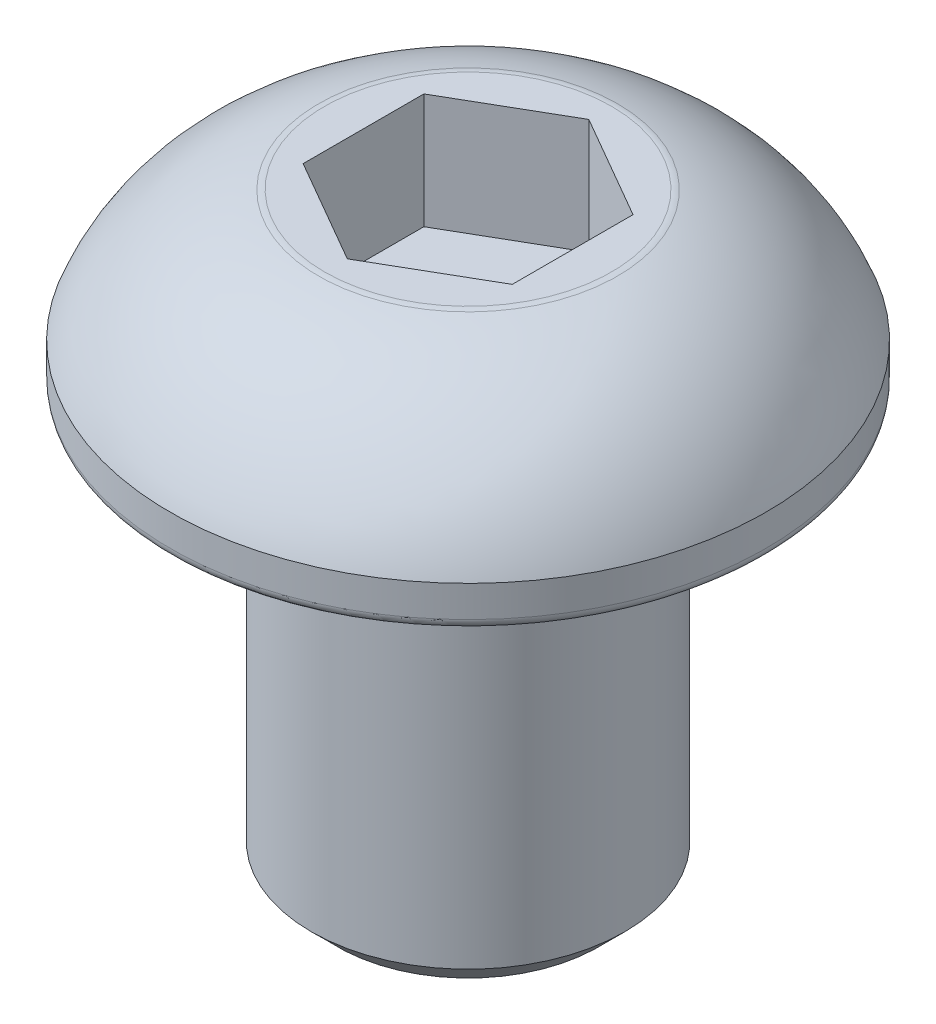
ISO-10303-21;
HEADER;
FILE_DESCRIPTION(('STEP AP214'),'2;1');
FILE_NAME('part.step','',(''),(''),'','','');
FILE_SCHEMA(('AUTOMOTIVE_DESIGN { 1 0 10303 214 1 1 1 1 }'));
ENDSEC;
DATA;
#1=APPLICATION_CONTEXT('core data for automotive mechanical design processes');
#2=APPLICATION_PROTOCOL_DEFINITION('international standard','automotive_design',2000,#1);
#3=PRODUCT_CONTEXT('',#1,'mechanical');
#4=PRODUCT('Part','Part','',(#3));
#5=PRODUCT_RELATED_PRODUCT_CATEGORY('part','',(#4));
#6=PRODUCT_DEFINITION_FORMATION('','',#4);
#7=PRODUCT_DEFINITION_CONTEXT('part definition',#1,'design');
#8=PRODUCT_DEFINITION('design','',#6,#7);
#9=PRODUCT_DEFINITION_SHAPE('','',#8);
#10=(LENGTH_UNIT() NAMED_UNIT(*) SI_UNIT(.MILLI.,.METRE.));
#11=(NAMED_UNIT(*) PLANE_ANGLE_UNIT() SI_UNIT($,.RADIAN.));
#12=(NAMED_UNIT(*) SI_UNIT($,.STERADIAN.) SOLID_ANGLE_UNIT());
#13=UNCERTAINTY_MEASURE_WITH_UNIT(LENGTH_MEASURE(1.E-05),#10,'distance_accuracy_value','');
#14=(GEOMETRIC_REPRESENTATION_CONTEXT(3) GLOBAL_UNCERTAINTY_ASSIGNED_CONTEXT((#13)) GLOBAL_UNIT_ASSIGNED_CONTEXT((#10,
#11,#12)) REPRESENTATION_CONTEXT('',''));
#15=CARTESIAN_POINT('',(0.,0.,0.));
#16=DIRECTION('',(0.,0.,1.));
#17=DIRECTION('',(1.,0.,0.));
#18=AXIS2_PLACEMENT_3D('',#15,#16,#17);
#19=CARTESIAN_POINT('',(0.,0.0999999999999998,0.));
#20=DIRECTION('',(0.,-1.,0.));
#21=DIRECTION('',(0.,0.,-1.));
#22=AXIS2_PLACEMENT_3D('',#19,#20,#21);
#23=TOROIDAL_SURFACE('',#22,2.75,0.0999999999999999);
#24=CARTESIAN_POINT('',(0.,0.,0.));
#25=DIRECTION('',(0.,-1.,0.));
#26=DIRECTION('',(0.,0.,-1.));
#27=AXIS2_PLACEMENT_3D('',#24,#25,#26);
#28=CIRCLE('',#27,2.75);
#29=CARTESIAN_POINT('',(0.,0.,-2.75));
#30=VERTEX_POINT('',#29);
#31=EDGE_CURVE('E136',#30,#30,#28,.T.);
#32=ORIENTED_EDGE('',*,*,#31,.F.);
#33=EDGE_LOOP('',(#32));
#34=FACE_BOUND('',#33,.T.);
#35=CARTESIAN_POINT('',(0.,0.1,0.));
#36=DIRECTION('',(0.,-1.,0.));
#37=DIRECTION('',(0.,0.,-1.));
#38=AXIS2_PLACEMENT_3D('',#35,#36,#37);
#39=CIRCLE('',#38,2.85);
#40=CARTESIAN_POINT('',(0.,0.1,-2.85));
#41=VERTEX_POINT('',#40);
#42=EDGE_CURVE('E11',#41,#41,#39,.T.);
#43=ORIENTED_EDGE('',*,*,#42,.T.);
#44=EDGE_LOOP('',(#43));
#45=FACE_BOUND('',#44,.T.);
#46=ADVANCED_FACE('F35',(#34,#45),#23,.T.);
#47=CARTESIAN_POINT('',(0.,-4.,0.));
#48=DIRECTION('',(0.,-1.,0.));
#49=DIRECTION('',(0.,0.,-1.));
#50=AXIS2_PLACEMENT_3D('',#47,#48,#49);
#51=CYLINDRICAL_SURFACE('',#50,2.85);
#52=ORIENTED_EDGE('',*,*,#42,.F.);
#53=EDGE_LOOP('',(#52));
#54=FACE_BOUND('',#53,.T.);
#55=CARTESIAN_POINT('',(0.,0.4,0.));
#56=DIRECTION('',(0.,-1.,0.));
#57=DIRECTION('',(0.,0.,-1.));
#58=AXIS2_PLACEMENT_3D('',#55,#56,#57);
#59=CIRCLE('',#58,2.85);
#60=CARTESIAN_POINT('',(0.,0.4,-2.85));
#61=VERTEX_POINT('',#60);
#62=EDGE_CURVE('E42',#61,#61,#59,.T.);
#63=ORIENTED_EDGE('',*,*,#62,.T.);
#64=EDGE_LOOP('',(#63));
#65=FACE_BOUND('',#64,.T.);
#66=ADVANCED_FACE('F164',(#54,#65),#51,.T.);
#67=CARTESIAN_POINT('',(0.,-0.305058043743636,0.));
#68=DIRECTION('',(0.,-1.,0.));
#69=DIRECTION('',(0.,0.,-1.));
#70=AXIS2_PLACEMENT_3D('',#67,#68,#69);
#71=DEGENERATE_TOROIDAL_SURFACE('',#70,0.978398238152038,2.,.T.);
#72=ORIENTED_EDGE('',*,*,#62,.F.);
#73=EDGE_LOOP('',(#72));
#74=FACE_BOUND('',#73,.T.);
#75=CARTESIAN_POINT('',(0.,1.64357972053481,0.));
#76=DIRECTION('',(0.,-1.,0.));
#77=DIRECTION('',(0.,0.,-1.));
#78=AXIS2_PLACEMENT_3D('',#75,#76,#77);
#79=CIRCLE('',#78,1.42874350972477);
#80=CARTESIAN_POINT('',(0.,1.64357972053481,-1.42874350972477));
#81=VERTEX_POINT('',#80);
#82=EDGE_CURVE('E159',#81,#81,#79,.T.);
#83=ORIENTED_EDGE('',*,*,#82,.T.);
#84=EDGE_LOOP('',(#83));
#85=FACE_BOUND('',#84,.T.);
#86=ADVANCED_FACE('F166',(#74,#85),#71,.T.);
#87=CARTESIAN_POINT('',(0.,1.4,0.));
#88=DIRECTION('',(0.,-1.,0.));
#89=DIRECTION('',(0.,0.,-1.));
#90=AXIS2_PLACEMENT_3D('',#87,#88,#89);
#91=TOROIDAL_SURFACE('',#90,1.37245035077818,0.25);
#92=ORIENTED_EDGE('',*,*,#82,.F.);
#93=EDGE_LOOP('',(#92));
#94=FACE_BOUND('',#93,.T.);
#95=CARTESIAN_POINT('',(0.,1.65,0.));
#96=DIRECTION('',(0.,-1.,0.));
#97=DIRECTION('',(0.,0.,-1.));
#98=AXIS2_PLACEMENT_3D('',#95,#96,#97);
#99=CIRCLE('',#98,1.37245035077818);
#100=CARTESIAN_POINT('',(0.,1.65,-1.37245035077818));
#101=VERTEX_POINT('',#100);
#102=EDGE_CURVE('E156',#101,#101,#99,.T.);
#103=ORIENTED_EDGE('',*,*,#102,.T.);
#104=EDGE_LOOP('',(#103));
#105=FACE_BOUND('',#104,.T.);
#106=ADVANCED_FACE('F169',(#94,#105),#91,.T.);
#107=CARTESIAN_POINT('',(-1.37245035077818,1.65,0.));
#108=DIRECTION('',(0.,-1.,0.));
#109=DIRECTION('',(0.,0.,-1.));
#110=AXIS2_PLACEMENT_3D('',#107,#108,#109);
#111=PLANE('',#110);
#112=DIRECTION('',(0.,0.,1.));
#113=VECTOR('',#112,1.);
#114=CARTESIAN_POINT('',(-1.,1.65,-0.577350269189625));
#115=LINE('',#114,#113);
#116=CARTESIAN_POINT('',(-1.,1.65,-0.577350269189625));
#117=VERTEX_POINT('',#116);
#118=CARTESIAN_POINT('',(-1.,1.65,0.577350269189626));
#119=VERTEX_POINT('',#118);
#120=EDGE_CURVE('E123',#117,#119,#115,.T.);
#121=ORIENTED_EDGE('',*,*,#120,.F.);
#122=DIRECTION('',(-0.866025403784438,0.,0.5));
#123=VECTOR('',#122,1.);
#124=CARTESIAN_POINT('',(0.,1.65,-1.15470053837925));
#125=LINE('',#124,#123);
#126=CARTESIAN_POINT('',(0.,1.65,-1.15470053837925));
#127=VERTEX_POINT('',#126);
#128=EDGE_CURVE('E49',#127,#117,#125,.T.);
#129=ORIENTED_EDGE('',*,*,#128,.F.);
#130=DIRECTION('',(-0.866025403784439,0.,-0.5));
#131=VECTOR('',#130,1.);
#132=CARTESIAN_POINT('',(1.,1.65,-0.577350269189626));
#133=LINE('',#132,#131);
#134=CARTESIAN_POINT('',(1.,1.65,-0.577350269189626));
#135=VERTEX_POINT('',#134);
#136=EDGE_CURVE('E132',#135,#127,#133,.T.);
#137=ORIENTED_EDGE('',*,*,#136,.F.);
#138=DIRECTION('',(0.,0.,-1.));
#139=VECTOR('',#138,1.);
#140=CARTESIAN_POINT('',(1.,1.65,0.577350269189625));
#141=LINE('',#140,#139);
#142=CARTESIAN_POINT('',(1.,1.65,0.577350269189625));
#143=VERTEX_POINT('',#142);
#144=EDGE_CURVE('E130',#143,#135,#141,.T.);
#145=ORIENTED_EDGE('',*,*,#144,.F.);
#146=DIRECTION('',(0.866025403784438,0.,-0.5));
#147=VECTOR('',#146,1.);
#148=CARTESIAN_POINT('',(0.,1.65,1.15470053837925));
#149=LINE('',#148,#147);
#150=CARTESIAN_POINT('',(0.,1.65,1.15470053837925));
#151=VERTEX_POINT('',#150);
#152=EDGE_CURVE('E97',#151,#143,#149,.T.);
#153=ORIENTED_EDGE('',*,*,#152,.F.);
#154=DIRECTION('',(0.866025403784439,0.,0.5));
#155=VECTOR('',#154,1.);
#156=CARTESIAN_POINT('',(-1.,1.65,0.577350269189626));
#157=LINE('',#156,#155);
#158=EDGE_CURVE('E126',#119,#151,#157,.T.);
#159=ORIENTED_EDGE('',*,*,#158,.F.);
#160=EDGE_LOOP('',(#121,#129,#137,#145,#153,#159));
#161=FACE_BOUND('',#160,.T.);
#162=ORIENTED_EDGE('',*,*,#102,.F.);
#163=EDGE_LOOP('',(#162));
#164=FACE_BOUND('',#163,.T.);
#165=ADVANCED_FACE('F175',(#161,#164),#111,.F.);
#166=CARTESIAN_POINT('',(-1.25,-4.,0.));
#167=DIRECTION('',(0.,1.,0.));
#168=DIRECTION('',(0.,0.,1.));
#169=AXIS2_PLACEMENT_3D('',#166,#167,#168);
#170=PLANE('',#169);
#171=CARTESIAN_POINT('',(0.,-4.,0.));
#172=DIRECTION('',(0.,-1.,0.));
#173=DIRECTION('',(0.,0.,-1.));
#174=AXIS2_PLACEMENT_3D('',#171,#172,#173);
#175=CIRCLE('',#174,1.25);
#176=CARTESIAN_POINT('',(0.,-4.,-1.25));
#177=VERTEX_POINT('',#176);
#178=EDGE_CURVE('E153',#177,#177,#175,.T.);
#179=ORIENTED_EDGE('',*,*,#178,.T.);
#180=EDGE_LOOP('',(#179));
#181=FACE_BOUND('',#180,.T.);
#182=ADVANCED_FACE('F180',(#181),#170,.F.);
#183=CARTESIAN_POINT('',(0.,-3.75,0.));
#184=DIRECTION('',(0.,1.,0.));
#185=DIRECTION('',(0.,0.,1.));
#186=AXIS2_PLACEMENT_3D('',#183,#184,#185);
#187=CONICAL_SURFACE('',#186,1.5,0.785398163397446);
#188=ORIENTED_EDGE('',*,*,#178,.F.);
#189=EDGE_LOOP('',(#188));
#190=FACE_BOUND('',#189,.T.);
#191=CARTESIAN_POINT('',(0.,-3.75,0.));
#192=DIRECTION('',(0.,-1.,0.));
#193=DIRECTION('',(0.,0.,-1.));
#194=AXIS2_PLACEMENT_3D('',#191,#192,#193);
#195=CIRCLE('',#194,1.5);
#196=CARTESIAN_POINT('',(0.,-3.75,-1.5));
#197=VERTEX_POINT('',#196);
#198=EDGE_CURVE('E150',#197,#197,#195,.T.);
#199=ORIENTED_EDGE('',*,*,#198,.T.);
#200=EDGE_LOOP('',(#199));
#201=FACE_BOUND('',#200,.T.);
#202=ADVANCED_FACE('F186',(#190,#201),#187,.T.);
#203=CARTESIAN_POINT('',(0.,-4.,0.));
#204=DIRECTION('',(0.,-1.,0.));
#205=DIRECTION('',(0.,0.,-1.));
#206=AXIS2_PLACEMENT_3D('',#203,#204,#205);
#207=CYLINDRICAL_SURFACE('',#206,1.5);
#208=ORIENTED_EDGE('',*,*,#198,.F.);
#209=EDGE_LOOP('',(#208));
#210=FACE_BOUND('',#209,.T.);
#211=CARTESIAN_POINT('',(0.,-0.100000000000001,0.));
#212=DIRECTION('',(0.,-1.,0.));
#213=DIRECTION('',(0.,0.,-1.));
#214=AXIS2_PLACEMENT_3D('',#211,#212,#213);
#215=CIRCLE('',#214,1.5);
#216=CARTESIAN_POINT('',(0.,-0.100000000000001,-1.5));
#217=VERTEX_POINT('',#216);
#218=EDGE_CURVE('E147',#217,#217,#215,.T.);
#219=ORIENTED_EDGE('',*,*,#218,.T.);
#220=EDGE_LOOP('',(#219));
#221=FACE_BOUND('',#220,.T.);
#222=ADVANCED_FACE('F212',(#210,#221),#207,.T.);
#223=CARTESIAN_POINT('',(0.,-0.1,0.));
#224=DIRECTION('',(0.,-1.,0.));
#225=DIRECTION('',(0.,0.,-1.));
#226=AXIS2_PLACEMENT_3D('',#223,#224,#225);
#227=TOROIDAL_SURFACE('',#226,1.6,0.1);
#228=ORIENTED_EDGE('',*,*,#218,.F.);
#229=EDGE_LOOP('',(#228));
#230=FACE_BOUND('',#229,.T.);
#231=CARTESIAN_POINT('',(0.,0.,0.));
#232=DIRECTION('',(0.,-1.,0.));
#233=DIRECTION('',(0.,0.,-1.));
#234=AXIS2_PLACEMENT_3D('',#231,#232,#233);
#235=CIRCLE('',#234,1.6);
#236=CARTESIAN_POINT('',(0.,0.,-1.6));
#237=VERTEX_POINT('',#236);
#238=EDGE_CURVE('E144',#237,#237,#235,.T.);
#239=ORIENTED_EDGE('',*,*,#238,.T.);
#240=EDGE_LOOP('',(#239));
#241=FACE_BOUND('',#240,.T.);
#242=ADVANCED_FACE('F203',(#230,#241),#227,.F.);
#243=CARTESIAN_POINT('',(-1.6,0.,0.));
#244=DIRECTION('',(0.,1.,0.));
#245=DIRECTION('',(0.,0.,1.));
#246=AXIS2_PLACEMENT_3D('',#243,#244,#245);
#247=PLANE('',#246);
#248=ORIENTED_EDGE('',*,*,#238,.F.);
#249=EDGE_LOOP('',(#248));
#250=FACE_BOUND('',#249,.T.);
#251=ORIENTED_EDGE('',*,*,#31,.T.);
#252=EDGE_LOOP('',(#251));
#253=FACE_BOUND('',#252,.T.);
#254=ADVANCED_FACE('F200',(#250,#253),#247,.F.);
#255=CARTESIAN_POINT('',(0.,0.55,-1.15470053837925));
#256=DIRECTION('',(-0.5,0.,-0.866025403784438));
#257=DIRECTION('',(-0.866025403784438,0.,0.5));
#258=AXIS2_PLACEMENT_3D('',#255,#256,#257);
#259=PLANE('',#258);
#260=ORIENTED_EDGE('',*,*,#128,.T.);
#261=DIRECTION('',(0.,1.,0.));
#262=VECTOR('',#261,1.);
#263=CARTESIAN_POINT('',(-1.,0.55,-0.577350269189625));
#264=LINE('',#263,#262);
#265=CARTESIAN_POINT('',(-1.,0.55,-0.577350269189625));
#266=VERTEX_POINT('',#265);
#267=EDGE_CURVE('E79',#266,#117,#264,.T.);
#268=ORIENTED_EDGE('',*,*,#267,.F.);
#269=DIRECTION('',(-0.866025403784438,0.,0.5));
#270=VECTOR('',#269,1.);
#271=CARTESIAN_POINT('',(0.,0.55,-1.15470053837925));
#272=LINE('',#271,#270);
#273=CARTESIAN_POINT('',(0.,0.55,-1.15470053837925));
#274=VERTEX_POINT('',#273);
#275=EDGE_CURVE('E134',#274,#266,#272,.T.);
#276=ORIENTED_EDGE('',*,*,#275,.F.);
#277=DIRECTION('',(0.,1.,0.));
#278=VECTOR('',#277,1.);
#279=CARTESIAN_POINT('',(0.,0.55,-1.15470053837925));
#280=LINE('',#279,#278);
#281=EDGE_CURVE('E57',#274,#127,#280,.T.);
#282=ORIENTED_EDGE('',*,*,#281,.T.);
#283=EDGE_LOOP('',(#260,#268,#276,#282));
#284=FACE_BOUND('',#283,.T.);
#285=ADVANCED_FACE('F202',(#284),#259,.F.);
#286=CARTESIAN_POINT('',(1.,0.55,-0.577350269189626));
#287=DIRECTION('',(0.5,0.,-0.866025403784439));
#288=DIRECTION('',(-0.866025403784439,0.,-0.5));
#289=AXIS2_PLACEMENT_3D('',#286,#287,#288);
#290=PLANE('',#289);
#291=ORIENTED_EDGE('',*,*,#136,.T.);
#292=ORIENTED_EDGE('',*,*,#281,.F.);
#293=DIRECTION('',(-0.866025403784439,0.,-0.5));
#294=VECTOR('',#293,1.);
#295=CARTESIAN_POINT('',(1.,0.55,-0.577350269189626));
#296=LINE('',#295,#294);
#297=CARTESIAN_POINT('',(1.,0.55,-0.577350269189626));
#298=VERTEX_POINT('',#297);
#299=EDGE_CURVE('E109',#298,#274,#296,.T.);
#300=ORIENTED_EDGE('',*,*,#299,.F.);
#301=DIRECTION('',(0.,1.,0.));
#302=VECTOR('',#301,1.);
#303=CARTESIAN_POINT('',(1.,0.55,-0.577350269189626));
#304=LINE('',#303,#302);
#305=EDGE_CURVE('E101',#298,#135,#304,.T.);
#306=ORIENTED_EDGE('',*,*,#305,.T.);
#307=EDGE_LOOP('',(#291,#292,#300,#306));
#308=FACE_BOUND('',#307,.T.);
#309=ADVANCED_FACE('F210',(#308),#290,.F.);
#310=CARTESIAN_POINT('',(1.,0.55,0.577350269189625));
#311=DIRECTION('',(1.,0.,0.));
#312=DIRECTION('',(0.,0.,-1.));
#313=AXIS2_PLACEMENT_3D('',#310,#311,#312);
#314=PLANE('',#313);
#315=ORIENTED_EDGE('',*,*,#144,.T.);
#316=ORIENTED_EDGE('',*,*,#305,.F.);
#317=DIRECTION('',(0.,0.,-1.));
#318=VECTOR('',#317,1.);
#319=CARTESIAN_POINT('',(1.,0.55,0.577350269189625));
#320=LINE('',#319,#318);
#321=CARTESIAN_POINT('',(1.,0.55,0.577350269189625));
#322=VERTEX_POINT('',#321);
#323=EDGE_CURVE('E105',#322,#298,#320,.T.);
#324=ORIENTED_EDGE('',*,*,#323,.F.);
#325=DIRECTION('',(0.,1.,0.));
#326=VECTOR('',#325,1.);
#327=CARTESIAN_POINT('',(1.,0.55,0.577350269189625));
#328=LINE('',#327,#326);
#329=EDGE_CURVE('E90',#322,#143,#328,.T.);
#330=ORIENTED_EDGE('',*,*,#329,.T.);
#331=EDGE_LOOP('',(#315,#316,#324,#330));
#332=FACE_BOUND('',#331,.T.);
#333=ADVANCED_FACE('F106',(#332),#314,.F.);
#334=CARTESIAN_POINT('',(0.,0.55,1.15470053837925));
#335=DIRECTION('',(0.5,0.,0.866025403784438));
#336=DIRECTION('',(0.866025403784438,0.,-0.5));
#337=AXIS2_PLACEMENT_3D('',#334,#335,#336);
#338=PLANE('',#337);
#339=ORIENTED_EDGE('',*,*,#152,.T.);
#340=ORIENTED_EDGE('',*,*,#329,.F.);
#341=DIRECTION('',(0.866025403784438,0.,-0.5));
#342=VECTOR('',#341,1.);
#343=CARTESIAN_POINT('',(0.,0.55,1.15470053837925));
#344=LINE('',#343,#342);
#345=CARTESIAN_POINT('',(0.,0.55,1.15470053837925));
#346=VERTEX_POINT('',#345);
#347=EDGE_CURVE('E94',#346,#322,#344,.T.);
#348=ORIENTED_EDGE('',*,*,#347,.F.);
#349=DIRECTION('',(0.,1.,0.));
#350=VECTOR('',#349,1.);
#351=CARTESIAN_POINT('',(0.,0.55,1.15470053837925));
#352=LINE('',#351,#350);
#353=EDGE_CURVE('E102',#346,#151,#352,.T.);
#354=ORIENTED_EDGE('',*,*,#353,.T.);
#355=EDGE_LOOP('',(#339,#340,#348,#354));
#356=FACE_BOUND('',#355,.T.);
#357=ADVANCED_FACE('F92',(#356),#338,.F.);
#358=CARTESIAN_POINT('',(-1.,0.55,0.577350269189626));
#359=DIRECTION('',(-0.5,0.,0.866025403784438));
#360=DIRECTION('',(0.866025403784439,0.,0.5));
#361=AXIS2_PLACEMENT_3D('',#358,#359,#360);
#362=PLANE('',#361);
#363=ORIENTED_EDGE('',*,*,#158,.T.);
#364=ORIENTED_EDGE('',*,*,#353,.F.);
#365=DIRECTION('',(0.866025403784439,0.,0.5));
#366=VECTOR('',#365,1.);
#367=CARTESIAN_POINT('',(-1.,0.55,0.577350269189626));
#368=LINE('',#367,#366);
#369=CARTESIAN_POINT('',(-1.,0.55,0.577350269189626));
#370=VERTEX_POINT('',#369);
#371=EDGE_CURVE('E115',#370,#346,#368,.T.);
#372=ORIENTED_EDGE('',*,*,#371,.F.);
#373=DIRECTION('',(0.,1.,0.));
#374=VECTOR('',#373,1.);
#375=CARTESIAN_POINT('',(-1.,0.55,0.577350269189626));
#376=LINE('',#375,#374);
#377=EDGE_CURVE('E139',#370,#119,#376,.T.);
#378=ORIENTED_EDGE('',*,*,#377,.T.);
#379=EDGE_LOOP('',(#363,#364,#372,#378));
#380=FACE_BOUND('',#379,.T.);
#381=ADVANCED_FACE('F282',(#380),#362,.F.);
#382=CARTESIAN_POINT('',(-1.,0.55,-0.577350269189625));
#383=DIRECTION('',(-1.,0.,0.));
#384=DIRECTION('',(0.,0.,1.));
#385=AXIS2_PLACEMENT_3D('',#382,#383,#384);
#386=PLANE('',#385);
#387=ORIENTED_EDGE('',*,*,#120,.T.);
#388=ORIENTED_EDGE('',*,*,#377,.F.);
#389=DIRECTION('',(0.,0.,1.));
#390=VECTOR('',#389,1.);
#391=CARTESIAN_POINT('',(-1.,0.55,-0.577350269189625));
#392=LINE('',#391,#390);
#393=EDGE_CURVE('E117',#266,#370,#392,.T.);
#394=ORIENTED_EDGE('',*,*,#393,.F.);
#395=ORIENTED_EDGE('',*,*,#267,.T.);
#396=EDGE_LOOP('',(#387,#388,#394,#395));
#397=FACE_BOUND('',#396,.T.);
#398=ADVANCED_FACE('F291',(#397),#386,.F.);
#399=CARTESIAN_POINT('',(0.,0.55,0.));
#400=DIRECTION('',(0.,1.,0.));
#401=DIRECTION('',(0.,0.,1.));
#402=AXIS2_PLACEMENT_3D('',#399,#400,#401);
#403=PLANE('',#402);
#404=ORIENTED_EDGE('',*,*,#275,.T.);
#405=ORIENTED_EDGE('',*,*,#393,.T.);
#406=ORIENTED_EDGE('',*,*,#371,.T.);
#407=ORIENTED_EDGE('',*,*,#347,.T.);
#408=ORIENTED_EDGE('',*,*,#323,.T.);
#409=ORIENTED_EDGE('',*,*,#299,.T.);
#410=EDGE_LOOP('',(#404,#405,#406,#407,#408,#409));
#411=FACE_BOUND('',#410,.T.);
#412=ADVANCED_FACE('F112',(#411),#403,.T.);
#413=CLOSED_SHELL('',(#46,#66,#86,#106,#165,#182,#202,#222,#242,#254,#285,#309,#333,#357,#381,
#398,#412));
#414=MANIFOLD_SOLID_BREP('B2',#413);
#415=ADVANCED_BREP_SHAPE_REPRESENTATION('',(#18,#414),#14);
#416=SHAPE_DEFINITION_REPRESENTATION(#9,#415);
ENDSEC;
END-ISO-10303-21;
